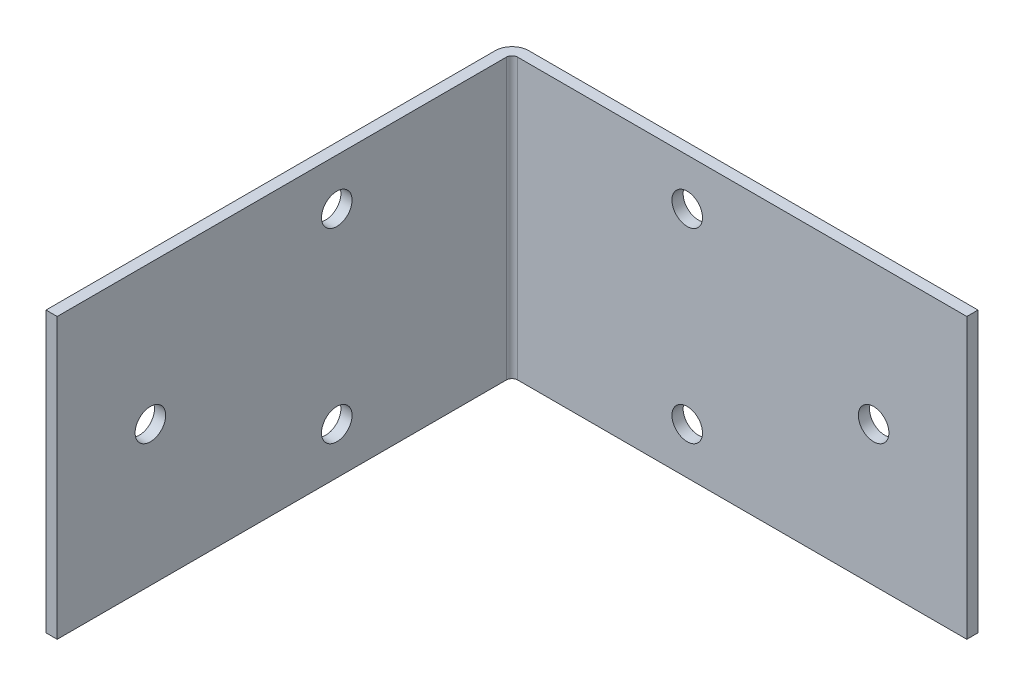
ISO-10303-21;
HEADER;
FILE_DESCRIPTION(('STEP AP214'),'2;1');
FILE_NAME('part.step','',(''),(''),'','','');
FILE_SCHEMA(('AUTOMOTIVE_DESIGN { 1 0 10303 214 1 1 1 1 }'));
ENDSEC;
DATA;
#1=APPLICATION_CONTEXT('core data for automotive mechanical design processes');
#2=APPLICATION_PROTOCOL_DEFINITION('international standard','automotive_design',2000,#1);
#3=PRODUCT_CONTEXT('',#1,'mechanical');
#4=PRODUCT('Part','Part','',(#3));
#5=PRODUCT_RELATED_PRODUCT_CATEGORY('part','',(#4));
#6=PRODUCT_DEFINITION_FORMATION('','',#4);
#7=PRODUCT_DEFINITION_CONTEXT('part definition',#1,'design');
#8=PRODUCT_DEFINITION('design','',#6,#7);
#9=PRODUCT_DEFINITION_SHAPE('','',#8);
#10=(LENGTH_UNIT() NAMED_UNIT(*) SI_UNIT(.MILLI.,.METRE.));
#11=(NAMED_UNIT(*) PLANE_ANGLE_UNIT() SI_UNIT($,.RADIAN.));
#12=(NAMED_UNIT(*) SI_UNIT($,.STERADIAN.) SOLID_ANGLE_UNIT());
#13=UNCERTAINTY_MEASURE_WITH_UNIT(LENGTH_MEASURE(1.E-05),#10,'distance_accuracy_value','');
#14=(GEOMETRIC_REPRESENTATION_CONTEXT(3) GLOBAL_UNCERTAINTY_ASSIGNED_CONTEXT((#13)) GLOBAL_UNIT_ASSIGNED_CONTEXT((#10,
#11,#12)) REPRESENTATION_CONTEXT('',''));
#15=CARTESIAN_POINT('',(0.,0.,0.));
#16=DIRECTION('',(0.,0.,1.));
#17=DIRECTION('',(1.,0.,0.));
#18=AXIS2_PLACEMENT_3D('',#15,#16,#17);
#19=CARTESIAN_POINT('',(2.286,19.05,1.524));
#20=DIRECTION('',(0.,0.,-1.));
#21=DIRECTION('',(-1.,0.,0.));
#22=AXIS2_PLACEMENT_3D('',#19,#20,#21);
#23=PLANE('',#22);
#24=CARTESIAN_POINT('',(25.4,12.7,1.52400000000008));
#25=DIRECTION('',(0.,0.,-1.));
#26=DIRECTION('',(-1.,0.,0.));
#27=AXIS2_PLACEMENT_3D('',#24,#25,#26);
#28=CIRCLE('',#27,2.0828);
#29=CARTESIAN_POINT('',(27.4828,12.7,1.52400000000009));
#30=VERTEX_POINT('',#29);
#31=EDGE_CURVE('E202',#30,#30,#28,.T.);
#32=ORIENTED_EDGE('',*,*,#31,.T.);
#33=EDGE_LOOP('',(#32));
#34=FACE_BOUND('',#33,.T.);
#35=DIRECTION('',(1.,0.,0.));
#36=VECTOR('',#35,1.);
#37=CARTESIAN_POINT('',(2.286,-19.05,1.524));
#38=LINE('',#37,#36);
#39=CARTESIAN_POINT('',(2.286,-19.05,1.524));
#40=VERTEX_POINT('',#39);
#41=CARTESIAN_POINT('',(63.5,-19.05,1.524));
#42=VERTEX_POINT('',#41);
#43=EDGE_CURVE('E129',#40,#42,#38,.T.);
#44=ORIENTED_EDGE('',*,*,#43,.T.);
#45=DIRECTION('',(0.,-1.,0.));
#46=VECTOR('',#45,1.);
#47=CARTESIAN_POINT('',(63.5,19.05,1.524));
#48=LINE('',#47,#46);
#49=CARTESIAN_POINT('',(63.5,19.05,1.524));
#50=VERTEX_POINT('',#49);
#51=EDGE_CURVE('E11',#50,#42,#48,.T.);
#52=ORIENTED_EDGE('',*,*,#51,.F.);
#53=DIRECTION('',(1.,0.,0.));
#54=VECTOR('',#53,1.);
#55=CARTESIAN_POINT('',(2.286,19.05,1.524));
#56=LINE('',#55,#54);
#57=CARTESIAN_POINT('',(2.286,19.05,1.524));
#58=VERTEX_POINT('',#57);
#59=EDGE_CURVE('E87',#58,#50,#56,.T.);
#60=ORIENTED_EDGE('',*,*,#59,.F.);
#61=DIRECTION('',(0.,-1.,0.));
#62=VECTOR('',#61,1.);
#63=CARTESIAN_POINT('',(2.286,19.05,1.524));
#64=LINE('',#63,#62);
#65=EDGE_CURVE('E128',#58,#40,#64,.T.);
#66=ORIENTED_EDGE('',*,*,#65,.T.);
#67=EDGE_LOOP('',(#44,#52,#60,#66));
#68=FACE_BOUND('',#67,.T.);
#69=CARTESIAN_POINT('',(50.8,0.,1.52400000000017));
#70=DIRECTION('',(0.,0.,-1.));
#71=DIRECTION('',(-1.,0.,0.));
#72=AXIS2_PLACEMENT_3D('',#69,#70,#71);
#73=CIRCLE('',#72,2.0828);
#74=CARTESIAN_POINT('',(52.8828,0.,1.52400000000017));
#75=VERTEX_POINT('',#74);
#76=EDGE_CURVE('E196',#75,#75,#73,.T.);
#77=ORIENTED_EDGE('',*,*,#76,.T.);
#78=EDGE_LOOP('',(#77));
#79=FACE_BOUND('',#78,.T.);
#80=CARTESIAN_POINT('',(25.4,-12.7,1.52400000000008));
#81=DIRECTION('',(0.,0.,-1.));
#82=DIRECTION('',(-1.,0.,0.));
#83=AXIS2_PLACEMENT_3D('',#80,#81,#82);
#84=CIRCLE('',#83,2.0828);
#85=CARTESIAN_POINT('',(27.4828,-12.7,1.52400000000009));
#86=VERTEX_POINT('',#85);
#87=EDGE_CURVE('E208',#86,#86,#84,.T.);
#88=ORIENTED_EDGE('',*,*,#87,.T.);
#89=EDGE_LOOP('',(#88));
#90=FACE_BOUND('',#89,.T.);
#91=ADVANCED_FACE('F32',(#34,#68,#79,#90),#23,.F.);
#92=CARTESIAN_POINT('',(2.286,19.05,0.));
#93=DIRECTION('',(0.,0.,-1.));
#94=DIRECTION('',(-1.,0.,0.));
#95=AXIS2_PLACEMENT_3D('',#92,#93,#94);
#96=PLANE('',#95);
#97=CARTESIAN_POINT('',(25.4,12.7,-1.2793585635329E-13));
#98=DIRECTION('',(0.,0.,-1.));
#99=DIRECTION('',(-1.,0.,0.));
#100=AXIS2_PLACEMENT_3D('',#97,#98,#99);
#101=CIRCLE('',#100,2.0828);
#102=CARTESIAN_POINT('',(27.4828,12.7,-1.20663799023187E-13));
#103=VERTEX_POINT('',#102);
#104=EDGE_CURVE('E199',#103,#103,#101,.T.);
#105=ORIENTED_EDGE('',*,*,#104,.F.);
#106=EDGE_LOOP('',(#105));
#107=FACE_BOUND('',#106,.T.);
#108=DIRECTION('',(1.,0.,0.));
#109=VECTOR('',#108,1.);
#110=CARTESIAN_POINT('',(2.286,-19.05,0.));
#111=LINE('',#110,#109);
#112=CARTESIAN_POINT('',(2.286,-19.05,0.));
#113=VERTEX_POINT('',#112);
#114=CARTESIAN_POINT('',(63.5,-19.05,0.));
#115=VERTEX_POINT('',#114);
#116=EDGE_CURVE('E136',#113,#115,#111,.T.);
#117=ORIENTED_EDGE('',*,*,#116,.F.);
#118=DIRECTION('',(0.,-1.,0.));
#119=VECTOR('',#118,1.);
#120=CARTESIAN_POINT('',(2.286,19.05,0.));
#121=LINE('',#120,#119);
#122=CARTESIAN_POINT('',(2.286,19.05,0.));
#123=VERTEX_POINT('',#122);
#124=EDGE_CURVE('E153',#123,#113,#121,.T.);
#125=ORIENTED_EDGE('',*,*,#124,.F.);
#126=DIRECTION('',(1.,0.,0.));
#127=VECTOR('',#126,1.);
#128=CARTESIAN_POINT('',(2.286,19.05,0.));
#129=LINE('',#128,#127);
#130=CARTESIAN_POINT('',(63.5,19.05,0.));
#131=VERTEX_POINT('',#130);
#132=EDGE_CURVE('E161',#123,#131,#129,.T.);
#133=ORIENTED_EDGE('',*,*,#132,.T.);
#134=DIRECTION('',(0.,-1.,0.));
#135=VECTOR('',#134,1.);
#136=CARTESIAN_POINT('',(63.5,19.05,0.));
#137=LINE('',#136,#135);
#138=EDGE_CURVE('E40',#131,#115,#137,.T.);
#139=ORIENTED_EDGE('',*,*,#138,.T.);
#140=EDGE_LOOP('',(#117,#125,#133,#139));
#141=FACE_BOUND('',#140,.T.);
#142=CARTESIAN_POINT('',(50.8,0.,0.));
#143=DIRECTION('',(0.,0.,-1.));
#144=DIRECTION('',(-1.,0.,0.));
#145=AXIS2_PLACEMENT_3D('',#142,#143,#144);
#146=CIRCLE('',#145,2.0828);
#147=CARTESIAN_POINT('',(52.8828,0.,0.));
#148=VERTEX_POINT('',#147);
#149=EDGE_CURVE('E193',#148,#148,#146,.T.);
#150=ORIENTED_EDGE('',*,*,#149,.F.);
#151=EDGE_LOOP('',(#150));
#152=FACE_BOUND('',#151,.T.);
#153=CARTESIAN_POINT('',(25.4,-12.7,-1.2793585635329E-13));
#154=DIRECTION('',(0.,0.,-1.));
#155=DIRECTION('',(-1.,0.,0.));
#156=AXIS2_PLACEMENT_3D('',#153,#154,#155);
#157=CIRCLE('',#156,2.0828);
#158=CARTESIAN_POINT('',(27.4828,-12.7,-1.20663799023187E-13));
#159=VERTEX_POINT('',#158);
#160=EDGE_CURVE('E205',#159,#159,#157,.T.);
#161=ORIENTED_EDGE('',*,*,#160,.F.);
#162=EDGE_LOOP('',(#161));
#163=FACE_BOUND('',#162,.T.);
#164=ADVANCED_FACE('F158',(#107,#141,#152,#163),#96,.T.);
#165=CARTESIAN_POINT('',(63.5,19.05,0.));
#166=DIRECTION('',(1.,0.,0.));
#167=DIRECTION('',(0.,0.,-1.));
#168=AXIS2_PLACEMENT_3D('',#165,#166,#167);
#169=PLANE('',#168);
#170=DIRECTION('',(0.,0.,1.));
#171=VECTOR('',#170,1.);
#172=CARTESIAN_POINT('',(63.5,-19.05,0.));
#173=LINE('',#172,#171);
#174=EDGE_CURVE('E132',#115,#42,#173,.T.);
#175=ORIENTED_EDGE('',*,*,#174,.F.);
#176=ORIENTED_EDGE('',*,*,#138,.F.);
#177=DIRECTION('',(0.,0.,1.));
#178=VECTOR('',#177,1.);
#179=CARTESIAN_POINT('',(63.5,19.05,0.));
#180=LINE('',#179,#178);
#181=EDGE_CURVE('E173',#131,#50,#180,.T.);
#182=ORIENTED_EDGE('',*,*,#181,.T.);
#183=ORIENTED_EDGE('',*,*,#51,.T.);
#184=EDGE_LOOP('',(#175,#176,#182,#183));
#185=FACE_BOUND('',#184,.T.);
#186=ADVANCED_FACE('F164',(#185),#169,.T.);
#187=CARTESIAN_POINT('',(2.286,19.05,2.286));
#188=DIRECTION('',(0.,-1.,0.));
#189=DIRECTION('',(0.,0.,-1.));
#190=AXIS2_PLACEMENT_3D('',#187,#188,#189);
#191=CYLINDRICAL_SURFACE('',#190,2.286);
#192=CARTESIAN_POINT('',(2.286,-19.05,2.286));
#193=DIRECTION('',(0.,-1.,0.));
#194=DIRECTION('',(0.,0.,1.));
#195=AXIS2_PLACEMENT_3D('',#192,#193,#194);
#196=CIRCLE('',#195,2.286);
#197=CARTESIAN_POINT('',(0.,-19.05,2.286));
#198=VERTEX_POINT('',#197);
#199=EDGE_CURVE('E139',#198,#113,#196,.T.);
#200=ORIENTED_EDGE('',*,*,#199,.F.);
#201=DIRECTION('',(0.,-1.,0.));
#202=VECTOR('',#201,1.);
#203=CARTESIAN_POINT('',(0.,19.05,2.286));
#204=LINE('',#203,#202);
#205=CARTESIAN_POINT('',(0.,19.05,2.286));
#206=VERTEX_POINT('',#205);
#207=EDGE_CURVE('E151',#206,#198,#204,.T.);
#208=ORIENTED_EDGE('',*,*,#207,.F.);
#209=CARTESIAN_POINT('',(2.286,19.05,2.286));
#210=DIRECTION('',(0.,-1.,0.));
#211=DIRECTION('',(0.,0.,1.));
#212=AXIS2_PLACEMENT_3D('',#209,#210,#211);
#213=CIRCLE('',#212,2.286);
#214=EDGE_CURVE('E123',#206,#123,#213,.T.);
#215=ORIENTED_EDGE('',*,*,#214,.T.);
#216=ORIENTED_EDGE('',*,*,#124,.T.);
#217=EDGE_LOOP('',(#200,#208,#215,#216));
#218=FACE_BOUND('',#217,.T.);
#219=ADVANCED_FACE('F171',(#218),#191,.T.);
#220=CARTESIAN_POINT('',(0.,19.05,63.5));
#221=DIRECTION('',(-1.,0.,0.));
#222=DIRECTION('',(0.,0.,1.));
#223=AXIS2_PLACEMENT_3D('',#220,#221,#222);
#224=PLANE('',#223);
#225=CARTESIAN_POINT('',(0.,-12.7,25.4));
#226=DIRECTION('',(1.,0.,0.));
#227=DIRECTION('',(0.,0.,-1.));
#228=AXIS2_PLACEMENT_3D('',#225,#226,#227);
#229=CIRCLE('',#228,2.0828);
#230=CARTESIAN_POINT('',(0.,-12.7,23.3172));
#231=VERTEX_POINT('',#230);
#232=EDGE_CURVE('E187',#231,#231,#229,.T.);
#233=ORIENTED_EDGE('',*,*,#232,.T.);
#234=EDGE_LOOP('',(#233));
#235=FACE_BOUND('',#234,.T.);
#236=CARTESIAN_POINT('',(0.,12.7,25.4));
#237=DIRECTION('',(1.,0.,0.));
#238=DIRECTION('',(0.,0.,-1.));
#239=AXIS2_PLACEMENT_3D('',#236,#237,#238);
#240=CIRCLE('',#239,2.0828);
#241=CARTESIAN_POINT('',(0.,12.7,23.3172));
#242=VERTEX_POINT('',#241);
#243=EDGE_CURVE('E181',#242,#242,#240,.T.);
#244=ORIENTED_EDGE('',*,*,#243,.T.);
#245=EDGE_LOOP('',(#244));
#246=FACE_BOUND('',#245,.T.);
#247=CARTESIAN_POINT('',(0.,0.,50.8));
#248=DIRECTION('',(1.,0.,0.));
#249=DIRECTION('',(0.,0.,-1.));
#250=AXIS2_PLACEMENT_3D('',#247,#248,#249);
#251=CIRCLE('',#250,2.0828);
#252=CARTESIAN_POINT('',(0.,0.,48.7172));
#253=VERTEX_POINT('',#252);
#254=EDGE_CURVE('E133',#253,#253,#251,.T.);
#255=ORIENTED_EDGE('',*,*,#254,.T.);
#256=EDGE_LOOP('',(#255));
#257=FACE_BOUND('',#256,.T.);
#258=DIRECTION('',(0.,0.,-1.));
#259=VECTOR('',#258,1.);
#260=CARTESIAN_POINT('',(0.,-19.05,63.5));
#261=LINE('',#260,#259);
#262=CARTESIAN_POINT('',(0.,-19.05,63.5));
#263=VERTEX_POINT('',#262);
#264=EDGE_CURVE('E142',#263,#198,#261,.T.);
#265=ORIENTED_EDGE('',*,*,#264,.F.);
#266=DIRECTION('',(0.,-1.,0.));
#267=VECTOR('',#266,1.);
#268=CARTESIAN_POINT('',(0.,19.05,63.5));
#269=LINE('',#268,#267);
#270=CARTESIAN_POINT('',(0.,19.05,63.5));
#271=VERTEX_POINT('',#270);
#272=EDGE_CURVE('E111',#271,#263,#269,.T.);
#273=ORIENTED_EDGE('',*,*,#272,.F.);
#274=DIRECTION('',(0.,0.,-1.));
#275=VECTOR('',#274,1.);
#276=CARTESIAN_POINT('',(0.,19.05,63.5));
#277=LINE('',#276,#275);
#278=EDGE_CURVE('E121',#271,#206,#277,.T.);
#279=ORIENTED_EDGE('',*,*,#278,.T.);
#280=ORIENTED_EDGE('',*,*,#207,.T.);
#281=EDGE_LOOP('',(#265,#273,#279,#280));
#282=FACE_BOUND('',#281,.T.);
#283=ADVANCED_FACE('F229',(#235,#246,#257,#282),#224,.T.);
#284=CARTESIAN_POINT('',(1.524,19.05,63.5));
#285=DIRECTION('',(0.,0.,1.));
#286=DIRECTION('',(1.,0.,0.));
#287=AXIS2_PLACEMENT_3D('',#284,#285,#286);
#288=PLANE('',#287);
#289=DIRECTION('',(-1.,0.,0.));
#290=VECTOR('',#289,1.);
#291=CARTESIAN_POINT('',(1.524,-19.05,63.5));
#292=LINE('',#291,#290);
#293=CARTESIAN_POINT('',(1.524,-19.05,63.5));
#294=VERTEX_POINT('',#293);
#295=EDGE_CURVE('E110',#294,#263,#292,.T.);
#296=ORIENTED_EDGE('',*,*,#295,.F.);
#297=DIRECTION('',(0.,-1.,0.));
#298=VECTOR('',#297,1.);
#299=CARTESIAN_POINT('',(1.524,19.05,63.5));
#300=LINE('',#299,#298);
#301=CARTESIAN_POINT('',(1.524,19.05,63.5));
#302=VERTEX_POINT('',#301);
#303=EDGE_CURVE('E104',#302,#294,#300,.T.);
#304=ORIENTED_EDGE('',*,*,#303,.F.);
#305=DIRECTION('',(-1.,0.,0.));
#306=VECTOR('',#305,1.);
#307=CARTESIAN_POINT('',(1.524,19.05,63.5));
#308=LINE('',#307,#306);
#309=EDGE_CURVE('E108',#302,#271,#308,.T.);
#310=ORIENTED_EDGE('',*,*,#309,.T.);
#311=ORIENTED_EDGE('',*,*,#272,.T.);
#312=EDGE_LOOP('',(#296,#304,#310,#311));
#313=FACE_BOUND('',#312,.T.);
#314=ADVANCED_FACE('F106',(#313),#288,.T.);
#315=CARTESIAN_POINT('',(1.524,19.05,63.5));
#316=DIRECTION('',(-1.,0.,0.));
#317=DIRECTION('',(0.,0.,1.));
#318=AXIS2_PLACEMENT_3D('',#315,#316,#317);
#319=PLANE('',#318);
#320=CARTESIAN_POINT('',(1.524,-12.7,25.4));
#321=DIRECTION('',(1.,0.,0.));
#322=DIRECTION('',(0.,0.,-1.));
#323=AXIS2_PLACEMENT_3D('',#320,#321,#322);
#324=CIRCLE('',#323,2.0828);
#325=CARTESIAN_POINT('',(1.524,-12.7,23.3172));
#326=VERTEX_POINT('',#325);
#327=EDGE_CURVE('E190',#326,#326,#324,.T.);
#328=ORIENTED_EDGE('',*,*,#327,.F.);
#329=EDGE_LOOP('',(#328));
#330=FACE_BOUND('',#329,.T.);
#331=CARTESIAN_POINT('',(1.524,12.7,25.4));
#332=DIRECTION('',(1.,0.,0.));
#333=DIRECTION('',(0.,0.,-1.));
#334=AXIS2_PLACEMENT_3D('',#331,#332,#333);
#335=CIRCLE('',#334,2.0828);
#336=CARTESIAN_POINT('',(1.524,12.7,23.3172));
#337=VERTEX_POINT('',#336);
#338=EDGE_CURVE('E184',#337,#337,#335,.T.);
#339=ORIENTED_EDGE('',*,*,#338,.F.);
#340=EDGE_LOOP('',(#339));
#341=FACE_BOUND('',#340,.T.);
#342=CARTESIAN_POINT('',(1.524,0.,50.8));
#343=DIRECTION('',(1.,0.,0.));
#344=DIRECTION('',(0.,0.,-1.));
#345=AXIS2_PLACEMENT_3D('',#342,#343,#344);
#346=CIRCLE('',#345,2.0828);
#347=CARTESIAN_POINT('',(1.524,0.,48.7172));
#348=VERTEX_POINT('',#347);
#349=EDGE_CURVE('E178',#348,#348,#346,.T.);
#350=ORIENTED_EDGE('',*,*,#349,.F.);
#351=EDGE_LOOP('',(#350));
#352=FACE_BOUND('',#351,.T.);
#353=DIRECTION('',(0.,0.,-1.));
#354=VECTOR('',#353,1.);
#355=CARTESIAN_POINT('',(1.524,-19.05,63.5));
#356=LINE('',#355,#354);
#357=CARTESIAN_POINT('',(1.524,-19.05,2.286));
#358=VERTEX_POINT('',#357);
#359=EDGE_CURVE('E75',#294,#358,#356,.T.);
#360=ORIENTED_EDGE('',*,*,#359,.T.);
#361=DIRECTION('',(0.,-1.,0.));
#362=VECTOR('',#361,1.);
#363=CARTESIAN_POINT('',(1.524,19.05,2.286));
#364=LINE('',#363,#362);
#365=CARTESIAN_POINT('',(1.524,19.05,2.286));
#366=VERTEX_POINT('',#365);
#367=EDGE_CURVE('E112',#366,#358,#364,.T.);
#368=ORIENTED_EDGE('',*,*,#367,.F.);
#369=DIRECTION('',(0.,0.,-1.));
#370=VECTOR('',#369,1.);
#371=CARTESIAN_POINT('',(1.524,19.05,63.5));
#372=LINE('',#371,#370);
#373=EDGE_CURVE('E114',#302,#366,#372,.T.);
#374=ORIENTED_EDGE('',*,*,#373,.F.);
#375=ORIENTED_EDGE('',*,*,#303,.T.);
#376=EDGE_LOOP('',(#360,#368,#374,#375));
#377=FACE_BOUND('',#376,.T.);
#378=ADVANCED_FACE('F115',(#330,#341,#352,#377),#319,.F.);
#379=CARTESIAN_POINT('',(2.286,19.05,2.286));
#380=DIRECTION('',(0.,-1.,0.));
#381=DIRECTION('',(0.,0.,-1.));
#382=AXIS2_PLACEMENT_3D('',#379,#380,#381);
#383=CYLINDRICAL_SURFACE('',#382,0.762);
#384=CARTESIAN_POINT('',(2.286,-19.05,2.286));
#385=DIRECTION('',(0.,1.,0.));
#386=DIRECTION('',(1.,0.,0.));
#387=AXIS2_PLACEMENT_3D('',#384,#385,#386);
#388=CIRCLE('',#387,0.762);
#389=EDGE_CURVE('E81',#358,#40,#388,.F.);
#390=ORIENTED_EDGE('',*,*,#389,.T.);
#391=ORIENTED_EDGE('',*,*,#65,.F.);
#392=CARTESIAN_POINT('',(2.286,19.05,2.286));
#393=DIRECTION('',(0.,1.,0.));
#394=DIRECTION('',(1.,0.,0.));
#395=AXIS2_PLACEMENT_3D('',#392,#393,#394);
#396=CIRCLE('',#395,0.762);
#397=EDGE_CURVE('E48',#366,#58,#396,.F.);
#398=ORIENTED_EDGE('',*,*,#397,.F.);
#399=ORIENTED_EDGE('',*,*,#367,.T.);
#400=EDGE_LOOP('',(#390,#391,#398,#399));
#401=FACE_BOUND('',#400,.T.);
#402=ADVANCED_FACE('F237',(#401),#383,.F.);
#403=CARTESIAN_POINT('',(2.286,19.05,2.286));
#404=DIRECTION('',(0.,-1.,0.));
#405=DIRECTION('',(-1.,0.,0.));
#406=AXIS2_PLACEMENT_3D('',#403,#404,#405);
#407=PLANE('',#406);
#408=ORIENTED_EDGE('',*,*,#59,.T.);
#409=ORIENTED_EDGE('',*,*,#181,.F.);
#410=ORIENTED_EDGE('',*,*,#132,.F.);
#411=ORIENTED_EDGE('',*,*,#214,.F.);
#412=ORIENTED_EDGE('',*,*,#278,.F.);
#413=ORIENTED_EDGE('',*,*,#309,.F.);
#414=ORIENTED_EDGE('',*,*,#373,.T.);
#415=ORIENTED_EDGE('',*,*,#397,.T.);
#416=EDGE_LOOP('',(#408,#409,#410,#411,#412,#413,#414,#415));
#417=FACE_BOUND('',#416,.T.);
#418=ADVANCED_FACE('F118',(#417),#407,.F.);
#419=CARTESIAN_POINT('',(2.286,-19.05,2.286));
#420=DIRECTION('',(0.,-1.,0.));
#421=DIRECTION('',(-1.,0.,0.));
#422=AXIS2_PLACEMENT_3D('',#419,#420,#421);
#423=PLANE('',#422);
#424=ORIENTED_EDGE('',*,*,#43,.F.);
#425=ORIENTED_EDGE('',*,*,#389,.F.);
#426=ORIENTED_EDGE('',*,*,#359,.F.);
#427=ORIENTED_EDGE('',*,*,#295,.T.);
#428=ORIENTED_EDGE('',*,*,#264,.T.);
#429=ORIENTED_EDGE('',*,*,#199,.T.);
#430=ORIENTED_EDGE('',*,*,#116,.T.);
#431=ORIENTED_EDGE('',*,*,#174,.T.);
#432=EDGE_LOOP('',(#424,#425,#426,#427,#428,#429,#430,#431));
#433=FACE_BOUND('',#432,.T.);
#434=ADVANCED_FACE('F167',(#433),#423,.T.);
#435=CARTESIAN_POINT('',(0.,0.,50.8));
#436=DIRECTION('',(1.,0.,0.));
#437=DIRECTION('',(0.,0.,-1.));
#438=AXIS2_PLACEMENT_3D('',#435,#436,#437);
#439=CYLINDRICAL_SURFACE('',#438,2.0828);
#440=ORIENTED_EDGE('',*,*,#254,.F.);
#441=EDGE_LOOP('',(#440));
#442=FACE_BOUND('',#441,.T.);
#443=ORIENTED_EDGE('',*,*,#349,.T.);
#444=EDGE_LOOP('',(#443));
#445=FACE_BOUND('',#444,.T.);
#446=ADVANCED_FACE('F243',(#442,#445),#439,.F.);
#447=CARTESIAN_POINT('',(0.,12.7,25.4));
#448=DIRECTION('',(1.,0.,0.));
#449=DIRECTION('',(0.,0.,-1.));
#450=AXIS2_PLACEMENT_3D('',#447,#448,#449);
#451=CYLINDRICAL_SURFACE('',#450,2.0828);
#452=ORIENTED_EDGE('',*,*,#243,.F.);
#453=EDGE_LOOP('',(#452));
#454=FACE_BOUND('',#453,.T.);
#455=ORIENTED_EDGE('',*,*,#338,.T.);
#456=EDGE_LOOP('',(#455));
#457=FACE_BOUND('',#456,.T.);
#458=ADVANCED_FACE('F248',(#454,#457),#451,.F.);
#459=CARTESIAN_POINT('',(0.,-12.7,25.4));
#460=DIRECTION('',(1.,0.,0.));
#461=DIRECTION('',(0.,0.,-1.));
#462=AXIS2_PLACEMENT_3D('',#459,#460,#461);
#463=CYLINDRICAL_SURFACE('',#462,2.0828);
#464=ORIENTED_EDGE('',*,*,#232,.F.);
#465=EDGE_LOOP('',(#464));
#466=FACE_BOUND('',#465,.T.);
#467=ORIENTED_EDGE('',*,*,#327,.T.);
#468=EDGE_LOOP('',(#467));
#469=FACE_BOUND('',#468,.T.);
#470=ADVANCED_FACE('F252',(#466,#469),#463,.F.);
#471=CARTESIAN_POINT('',(50.8,0.,0.));
#472=DIRECTION('',(0.,0.,1.));
#473=DIRECTION('',(1.,0.,0.));
#474=AXIS2_PLACEMENT_3D('',#471,#472,#473);
#475=CYLINDRICAL_SURFACE('',#474,2.0828);
#476=CARTESIAN_POINT('',(52.8828,0.,0.));
#477=CARTESIAN_POINT('',(52.8828,0.,0.0158749999999646));
#478=CARTESIAN_POINT('',(52.8828,0.,0.0317499999999668));
#479=CARTESIAN_POINT('',(52.8828,0.,0.0634999999999712));
#480=CARTESIAN_POINT('',(52.8828,0.,0.0793749999999734));
#481=CARTESIAN_POINT('',(52.8828,0.,0.111124999999978));
#482=CARTESIAN_POINT('',(52.8828,0.,0.12699999999998));
#483=CARTESIAN_POINT('',(52.8828,0.,0.158749999999984));
#484=CARTESIAN_POINT('',(52.8828,0.,0.174624999999987));
#485=CARTESIAN_POINT('',(52.8828,0.,0.206374999999991));
#486=CARTESIAN_POINT('',(52.8828,0.,0.222249999999993));
#487=CARTESIAN_POINT('',(52.8828,0.,0.253999999999998));
#488=CARTESIAN_POINT('',(52.8828,0.,0.269875));
#489=CARTESIAN_POINT('',(52.8828,0.,0.301625000000004));
#490=CARTESIAN_POINT('',(52.8828,0.,0.317500000000006));
#491=CARTESIAN_POINT('',(52.8828,0.,0.349250000000011));
#492=CARTESIAN_POINT('',(52.8828,0.,0.365125000000013));
#493=CARTESIAN_POINT('',(52.8828,0.,0.396875000000017));
#494=CARTESIAN_POINT('',(52.8828,0.,0.412750000000019));
#495=CARTESIAN_POINT('',(52.8828,0.,0.444500000000024));
#496=CARTESIAN_POINT('',(52.8828,0.,0.460375000000026));
#497=CARTESIAN_POINT('',(52.8828,0.,0.49212500000003));
#498=CARTESIAN_POINT('',(52.8828,0.,0.508000000000033));
#499=CARTESIAN_POINT('',(52.8828,0.,0.539750000000037));
#500=CARTESIAN_POINT('',(52.8828,0.,0.555625000000039));
#501=CARTESIAN_POINT('',(52.8828,0.,0.587375000000044));
#502=CARTESIAN_POINT('',(52.8828,0.,0.603250000000046));
#503=CARTESIAN_POINT('',(52.8828,0.,0.63500000000005));
#504=CARTESIAN_POINT('',(52.8828,0.,0.650875000000052));
#505=CARTESIAN_POINT('',(52.8828,0.,0.682625000000057));
#506=CARTESIAN_POINT('',(52.8828,0.,0.698500000000059));
#507=CARTESIAN_POINT('',(52.8828,0.,0.730250000000063));
#508=CARTESIAN_POINT('',(52.8828,0.,0.746125000000066));
#509=CARTESIAN_POINT('',(52.8828,0.,0.77787500000007));
#510=CARTESIAN_POINT('',(52.8828,0.,0.793750000000072));
#511=CARTESIAN_POINT('',(52.8828,0.,0.825500000000077));
#512=CARTESIAN_POINT('',(52.8828,0.,0.841375000000079));
#513=CARTESIAN_POINT('',(52.8828,0.,0.873125000000083));
#514=CARTESIAN_POINT('',(52.8828,0.,0.889000000000085));
#515=CARTESIAN_POINT('',(52.8828,0.,0.92075000000009));
#516=CARTESIAN_POINT('',(52.8828,0.,0.936625000000092));
#517=CARTESIAN_POINT('',(52.8828,0.,0.968375000000096));
#518=CARTESIAN_POINT('',(52.8828,0.,0.984250000000099));
#519=CARTESIAN_POINT('',(52.8828,0.,1.0160000000001));
#520=CARTESIAN_POINT('',(52.8828,0.,1.0318750000001));
#521=CARTESIAN_POINT('',(52.8828,0.,1.06362500000011));
#522=CARTESIAN_POINT('',(52.8828,0.,1.07950000000011));
#523=CARTESIAN_POINT('',(52.8828,0.,1.11125000000012));
#524=CARTESIAN_POINT('',(52.8828,0.,1.12712500000012));
#525=CARTESIAN_POINT('',(52.8828,0.,1.15887500000012));
#526=CARTESIAN_POINT('',(52.8828,0.,1.17475000000012));
#527=CARTESIAN_POINT('',(52.8828,0.,1.20650000000013));
#528=CARTESIAN_POINT('',(52.8828,0.,1.22237500000013));
#529=CARTESIAN_POINT('',(52.8828,0.,1.25412500000014));
#530=CARTESIAN_POINT('',(52.8828,0.,1.27000000000014));
#531=CARTESIAN_POINT('',(52.8828,0.,1.30175000000014));
#532=CARTESIAN_POINT('',(52.8828,0.,1.31762500000014));
#533=CARTESIAN_POINT('',(52.8828,0.,1.34937500000015));
#534=CARTESIAN_POINT('',(52.8828,0.,1.36525000000015));
#535=CARTESIAN_POINT('',(52.8828,0.,1.39700000000016));
#536=CARTESIAN_POINT('',(52.8828,0.,1.41287500000016));
#537=CARTESIAN_POINT('',(52.8828,0.,1.44462500000016));
#538=CARTESIAN_POINT('',(52.8828,0.,1.46050000000016));
#539=CARTESIAN_POINT('',(52.8828,0.,1.49225000000017));
#540=CARTESIAN_POINT('',(52.8828,0.,1.50812500000017));
#541=CARTESIAN_POINT('',(52.8828,0.,1.52400000000017));
#542=B_SPLINE_CURVE_WITH_KNOTS('',3,(#476,#477,#478,#479,#480,#481,#482,#483,#484,#485,#486,
#487,#488,#489,#490,#491,#492,#493,#494,#495,#496,#497,#498,#499,#500,#501,#502,#503,#504,#505,
#506,#507,#508,#509,#510,#511,#512,#513,#514,#515,#516,#517,#518,#519,#520,#521,#522,#523,#524,
#525,#526,#527,#528,#529,#530,#531,#532,#533,#534,#535,#536,#537,#538,#539,#540,#541),
.UNSPECIFIED.,.F.,.F.,(4,2,2,2,2,2,2,2,2,2,2,2,2,2,2,2,2,2,2,2,2,2,2,2,2,2,2,2,2,2,2,2,4),(0.,
0.0476250000000066,0.0952500000000132,0.14287500000002,0.190500000000026,0.238125000000033,
0.285750000000039,0.333375000000046,0.381000000000053,0.428625000000059,0.476250000000066,
0.523875000000072,0.571500000000079,0.619125000000086,0.666750000000092,0.714375000000099,
0.762000000000105,0.809625000000112,0.857250000000119,0.904875000000125,0.952500000000132,
1.00012500000014,1.04775000000014,1.09537500000015,1.14300000000016,1.19062500000016,
1.23825000000017,1.28587500000018,1.33350000000018,1.38112500000019,1.4287500000002,
1.4763750000002,1.52400000000021),.UNSPECIFIED.);
#543=EDGE_CURVE('BSEAM256',#148,#75,#542,.T.);
#544=ORIENTED_EDGE('',*,*,#149,.T.);
#545=ORIENTED_EDGE('',*,*,#76,.F.);
#546=ORIENTED_EDGE('',*,*,#543,.T.);
#547=ORIENTED_EDGE('',*,*,#543,.F.);
#548=EDGE_LOOP('',(#544,#546,#545,#547));
#549=FACE_BOUND('',#548,.T.);
#550=ADVANCED_FACE('F256',(#549),#475,.F.);
#551=CARTESIAN_POINT('',(25.4,12.7,-1.2793585635329E-13));
#552=DIRECTION('',(0.,0.,1.));
#553=DIRECTION('',(1.,0.,0.));
#554=AXIS2_PLACEMENT_3D('',#551,#552,#553);
#555=CYLINDRICAL_SURFACE('',#554,2.0828);
#556=CARTESIAN_POINT('',(27.4828,12.7,-1.20663799023187E-13));
#557=CARTESIAN_POINT('',(27.4828,12.7,0.0158749999998815));
#558=CARTESIAN_POINT('',(27.4828,12.7,0.0317499999998837));
#559=CARTESIAN_POINT('',(27.4828,12.7,0.0634999999998881));
#560=CARTESIAN_POINT('',(27.4828,12.7,0.0793749999998903));
#561=CARTESIAN_POINT('',(27.4828,12.7,0.111124999999895));
#562=CARTESIAN_POINT('',(27.4828,12.7,0.126999999999897));
#563=CARTESIAN_POINT('',(27.4828,12.7,0.158749999999901));
#564=CARTESIAN_POINT('',(27.4828,12.7,0.174624999999903));
#565=CARTESIAN_POINT('',(27.4828,12.7,0.206374999999908));
#566=CARTESIAN_POINT('',(27.4828,12.7,0.22224999999991));
#567=CARTESIAN_POINT('',(27.4828,12.7,0.253999999999914));
#568=CARTESIAN_POINT('',(27.4828,12.7,0.269874999999917));
#569=CARTESIAN_POINT('',(27.4828,12.7,0.301624999999921));
#570=CARTESIAN_POINT('',(27.4828,12.7,0.317499999999923));
#571=CARTESIAN_POINT('',(27.4828,12.7,0.349249999999928));
#572=CARTESIAN_POINT('',(27.4828,12.7,0.36512499999993));
#573=CARTESIAN_POINT('',(27.4828,12.7,0.396874999999934));
#574=CARTESIAN_POINT('',(27.4828,12.7,0.412749999999936));
#575=CARTESIAN_POINT('',(27.4828,12.7,0.444499999999941));
#576=CARTESIAN_POINT('',(27.4828,12.7,0.460374999999943));
#577=CARTESIAN_POINT('',(27.4828,12.7,0.492124999999947));
#578=CARTESIAN_POINT('',(27.4828,12.7,0.50799999999995));
#579=CARTESIAN_POINT('',(27.4828,12.7,0.539749999999954));
#580=CARTESIAN_POINT('',(27.4828,12.7,0.555624999999956));
#581=CARTESIAN_POINT('',(27.4828,12.7,0.587374999999961));
#582=CARTESIAN_POINT('',(27.4828,12.7,0.603249999999963));
#583=CARTESIAN_POINT('',(27.4828,12.7,0.634999999999967));
#584=CARTESIAN_POINT('',(27.4828,12.7,0.650874999999969));
#585=CARTESIAN_POINT('',(27.4828,12.7,0.682624999999974));
#586=CARTESIAN_POINT('',(27.4828,12.7,0.698499999999976));
#587=CARTESIAN_POINT('',(27.4828,12.7,0.73024999999998));
#588=CARTESIAN_POINT('',(27.4828,12.7,0.746124999999982));
#589=CARTESIAN_POINT('',(27.4828,12.7,0.777874999999987));
#590=CARTESIAN_POINT('',(27.4828,12.7,0.793749999999989));
#591=CARTESIAN_POINT('',(27.4828,12.7,0.825499999999994));
#592=CARTESIAN_POINT('',(27.4828,12.7,0.841374999999996));
#593=CARTESIAN_POINT('',(27.4828,12.7,0.873125));
#594=CARTESIAN_POINT('',(27.4828,12.7,0.889000000000002));
#595=CARTESIAN_POINT('',(27.4828,12.7,0.920750000000007));
#596=CARTESIAN_POINT('',(27.4828,12.7,0.936625000000009));
#597=CARTESIAN_POINT('',(27.4828,12.7,0.968375000000013));
#598=CARTESIAN_POINT('',(27.4828,12.7,0.984250000000016));
#599=CARTESIAN_POINT('',(27.4828,12.7,1.01600000000002));
#600=CARTESIAN_POINT('',(27.4828,12.7,1.03187500000002));
#601=CARTESIAN_POINT('',(27.4828,12.7,1.06362500000003));
#602=CARTESIAN_POINT('',(27.4828,12.7,1.07950000000003));
#603=CARTESIAN_POINT('',(27.4828,12.7,1.11125000000003));
#604=CARTESIAN_POINT('',(27.4828,12.7,1.12712500000004));
#605=CARTESIAN_POINT('',(27.4828,12.7,1.15887500000004));
#606=CARTESIAN_POINT('',(27.4828,12.7,1.17475000000004));
#607=CARTESIAN_POINT('',(27.4828,12.7,1.20650000000005));
#608=CARTESIAN_POINT('',(27.4828,12.7,1.22237500000005));
#609=CARTESIAN_POINT('',(27.4828,12.7,1.25412500000005));
#610=CARTESIAN_POINT('',(27.4828,12.7,1.27000000000005));
#611=CARTESIAN_POINT('',(27.4828,12.7,1.30175000000006));
#612=CARTESIAN_POINT('',(27.4828,12.7,1.31762500000006));
#613=CARTESIAN_POINT('',(27.4828,12.7,1.34937500000007));
#614=CARTESIAN_POINT('',(27.4828,12.7,1.36525000000007));
#615=CARTESIAN_POINT('',(27.4828,12.7,1.39700000000007));
#616=CARTESIAN_POINT('',(27.4828,12.7,1.41287500000007));
#617=CARTESIAN_POINT('',(27.4828,12.7,1.44462500000008));
#618=CARTESIAN_POINT('',(27.4828,12.7,1.46050000000008));
#619=CARTESIAN_POINT('',(27.4828,12.7,1.49225000000009));
#620=CARTESIAN_POINT('',(27.4828,12.7,1.50812500000009));
#621=CARTESIAN_POINT('',(27.4828,12.7,1.52400000000009));
#622=B_SPLINE_CURVE_WITH_KNOTS('',3,(#556,#557,#558,#559,#560,#561,#562,#563,#564,#565,#566,
#567,#568,#569,#570,#571,#572,#573,#574,#575,#576,#577,#578,#579,#580,#581,#582,#583,#584,#585,
#586,#587,#588,#589,#590,#591,#592,#593,#594,#595,#596,#597,#598,#599,#600,#601,#602,#603,#604,
#605,#606,#607,#608,#609,#610,#611,#612,#613,#614,#615,#616,#617,#618,#619,#620,#621),
.UNSPECIFIED.,.F.,.F.,(4,2,2,2,2,2,2,2,2,2,2,2,2,2,2,2,2,2,2,2,2,2,2,2,2,2,2,2,2,2,2,2,4),(0.,
0.0476250000000066,0.0952500000000132,0.14287500000002,0.190500000000026,0.238125000000033,
0.285750000000039,0.333375000000046,0.381000000000053,0.428625000000059,0.476250000000066,
0.523875000000072,0.571500000000079,0.619125000000086,0.666750000000092,0.714375000000099,
0.762000000000105,0.809625000000112,0.857250000000119,0.904875000000125,0.952500000000132,
1.00012500000014,1.04775000000014,1.09537500000015,1.14300000000016,1.19062500000016,
1.23825000000017,1.28587500000018,1.33350000000018,1.38112500000019,1.4287500000002,
1.4763750000002,1.52400000000021),.UNSPECIFIED.);
#623=EDGE_CURVE('BSEAM260',#103,#30,#622,.T.);
#624=ORIENTED_EDGE('',*,*,#104,.T.);
#625=ORIENTED_EDGE('',*,*,#31,.F.);
#626=ORIENTED_EDGE('',*,*,#623,.T.);
#627=ORIENTED_EDGE('',*,*,#623,.F.);
#628=EDGE_LOOP('',(#624,#626,#625,#627));
#629=FACE_BOUND('',#628,.T.);
#630=ADVANCED_FACE('F260',(#629),#555,.F.);
#631=CARTESIAN_POINT('',(25.4,-12.7,-1.2793585635329E-13));
#632=DIRECTION('',(0.,0.,1.));
#633=DIRECTION('',(1.,0.,0.));
#634=AXIS2_PLACEMENT_3D('',#631,#632,#633);
#635=CYLINDRICAL_SURFACE('',#634,2.0828);
#636=CARTESIAN_POINT('',(27.4828,-12.7,-1.20663799023187E-13));
#637=CARTESIAN_POINT('',(27.4828,-12.7,0.0158749999998815));
#638=CARTESIAN_POINT('',(27.4828,-12.7,0.0317499999998837));
#639=CARTESIAN_POINT('',(27.4828,-12.7,0.0634999999998881));
#640=CARTESIAN_POINT('',(27.4828,-12.7,0.0793749999998903));
#641=CARTESIAN_POINT('',(27.4828,-12.7,0.111124999999895));
#642=CARTESIAN_POINT('',(27.4828,-12.7,0.126999999999897));
#643=CARTESIAN_POINT('',(27.4828,-12.7,0.158749999999901));
#644=CARTESIAN_POINT('',(27.4828,-12.7,0.174624999999903));
#645=CARTESIAN_POINT('',(27.4828,-12.7,0.206374999999908));
#646=CARTESIAN_POINT('',(27.4828,-12.7,0.22224999999991));
#647=CARTESIAN_POINT('',(27.4828,-12.7,0.253999999999914));
#648=CARTESIAN_POINT('',(27.4828,-12.7,0.269874999999917));
#649=CARTESIAN_POINT('',(27.4828,-12.7,0.301624999999921));
#650=CARTESIAN_POINT('',(27.4828,-12.7,0.317499999999923));
#651=CARTESIAN_POINT('',(27.4828,-12.7,0.349249999999928));
#652=CARTESIAN_POINT('',(27.4828,-12.7,0.36512499999993));
#653=CARTESIAN_POINT('',(27.4828,-12.7,0.396874999999934));
#654=CARTESIAN_POINT('',(27.4828,-12.7,0.412749999999936));
#655=CARTESIAN_POINT('',(27.4828,-12.7,0.444499999999941));
#656=CARTESIAN_POINT('',(27.4828,-12.7,0.460374999999943));
#657=CARTESIAN_POINT('',(27.4828,-12.7,0.492124999999947));
#658=CARTESIAN_POINT('',(27.4828,-12.7,0.50799999999995));
#659=CARTESIAN_POINT('',(27.4828,-12.7,0.539749999999954));
#660=CARTESIAN_POINT('',(27.4828,-12.7,0.555624999999956));
#661=CARTESIAN_POINT('',(27.4828,-12.7,0.587374999999961));
#662=CARTESIAN_POINT('',(27.4828,-12.7,0.603249999999963));
#663=CARTESIAN_POINT('',(27.4828,-12.7,0.634999999999967));
#664=CARTESIAN_POINT('',(27.4828,-12.7,0.650874999999969));
#665=CARTESIAN_POINT('',(27.4828,-12.7,0.682624999999974));
#666=CARTESIAN_POINT('',(27.4828,-12.7,0.698499999999976));
#667=CARTESIAN_POINT('',(27.4828,-12.7,0.73024999999998));
#668=CARTESIAN_POINT('',(27.4828,-12.7,0.746124999999982));
#669=CARTESIAN_POINT('',(27.4828,-12.7,0.777874999999987));
#670=CARTESIAN_POINT('',(27.4828,-12.7,0.793749999999989));
#671=CARTESIAN_POINT('',(27.4828,-12.7,0.825499999999994));
#672=CARTESIAN_POINT('',(27.4828,-12.7,0.841374999999996));
#673=CARTESIAN_POINT('',(27.4828,-12.7,0.873125));
#674=CARTESIAN_POINT('',(27.4828,-12.7,0.889000000000002));
#675=CARTESIAN_POINT('',(27.4828,-12.7,0.920750000000007));
#676=CARTESIAN_POINT('',(27.4828,-12.7,0.936625000000009));
#677=CARTESIAN_POINT('',(27.4828,-12.7,0.968375000000013));
#678=CARTESIAN_POINT('',(27.4828,-12.7,0.984250000000016));
#679=CARTESIAN_POINT('',(27.4828,-12.7,1.01600000000002));
#680=CARTESIAN_POINT('',(27.4828,-12.7,1.03187500000002));
#681=CARTESIAN_POINT('',(27.4828,-12.7,1.06362500000003));
#682=CARTESIAN_POINT('',(27.4828,-12.7,1.07950000000003));
#683=CARTESIAN_POINT('',(27.4828,-12.7,1.11125000000003));
#684=CARTESIAN_POINT('',(27.4828,-12.7,1.12712500000004));
#685=CARTESIAN_POINT('',(27.4828,-12.7,1.15887500000004));
#686=CARTESIAN_POINT('',(27.4828,-12.7,1.17475000000004));
#687=CARTESIAN_POINT('',(27.4828,-12.7,1.20650000000005));
#688=CARTESIAN_POINT('',(27.4828,-12.7,1.22237500000005));
#689=CARTESIAN_POINT('',(27.4828,-12.7,1.25412500000005));
#690=CARTESIAN_POINT('',(27.4828,-12.7,1.27000000000005));
#691=CARTESIAN_POINT('',(27.4828,-12.7,1.30175000000006));
#692=CARTESIAN_POINT('',(27.4828,-12.7,1.31762500000006));
#693=CARTESIAN_POINT('',(27.4828,-12.7,1.34937500000007));
#694=CARTESIAN_POINT('',(27.4828,-12.7,1.36525000000007));
#695=CARTESIAN_POINT('',(27.4828,-12.7,1.39700000000007));
#696=CARTESIAN_POINT('',(27.4828,-12.7,1.41287500000007));
#697=CARTESIAN_POINT('',(27.4828,-12.7,1.44462500000008));
#698=CARTESIAN_POINT('',(27.4828,-12.7,1.46050000000008));
#699=CARTESIAN_POINT('',(27.4828,-12.7,1.49225000000009));
#700=CARTESIAN_POINT('',(27.4828,-12.7,1.50812500000009));
#701=CARTESIAN_POINT('',(27.4828,-12.7,1.52400000000009));
#702=B_SPLINE_CURVE_WITH_KNOTS('',3,(#636,#637,#638,#639,#640,#641,#642,#643,#644,#645,#646,
#647,#648,#649,#650,#651,#652,#653,#654,#655,#656,#657,#658,#659,#660,#661,#662,#663,#664,#665,
#666,#667,#668,#669,#670,#671,#672,#673,#674,#675,#676,#677,#678,#679,#680,#681,#682,#683,#684,
#685,#686,#687,#688,#689,#690,#691,#692,#693,#694,#695,#696,#697,#698,#699,#700,#701),
.UNSPECIFIED.,.F.,.F.,(4,2,2,2,2,2,2,2,2,2,2,2,2,2,2,2,2,2,2,2,2,2,2,2,2,2,2,2,2,2,2,2,4),(0.,
0.0476250000000066,0.0952500000000132,0.14287500000002,0.190500000000026,0.238125000000033,
0.285750000000039,0.333375000000046,0.381000000000053,0.428625000000059,0.476250000000066,
0.523875000000072,0.571500000000079,0.619125000000086,0.666750000000092,0.714375000000099,
0.762000000000105,0.809625000000112,0.857250000000119,0.904875000000125,0.952500000000132,
1.00012500000014,1.04775000000014,1.09537500000015,1.14300000000016,1.19062500000016,
1.23825000000017,1.28587500000018,1.33350000000018,1.38112500000019,1.4287500000002,
1.4763750000002,1.52400000000021),.UNSPECIFIED.);
#703=EDGE_CURVE('BSEAM214',#159,#86,#702,.T.);
#704=ORIENTED_EDGE('',*,*,#160,.T.);
#705=ORIENTED_EDGE('',*,*,#87,.F.);
#706=ORIENTED_EDGE('',*,*,#703,.T.);
#707=ORIENTED_EDGE('',*,*,#703,.F.);
#708=EDGE_LOOP('',(#704,#706,#705,#707));
#709=FACE_BOUND('',#708,.T.);
#710=ADVANCED_FACE('F214',(#709),#635,.F.);
#711=CLOSED_SHELL('',(#91,#164,#186,#219,#283,#314,#378,#402,#418,#434,#446,#458,#470,#550,#630,#710));
#712=MANIFOLD_SOLID_BREP('B2',#711);
#713=ADVANCED_BREP_SHAPE_REPRESENTATION('',(#18,#712),#14);
#714=SHAPE_DEFINITION_REPRESENTATION(#9,#713);
ENDSEC;
END-ISO-10303-21;
